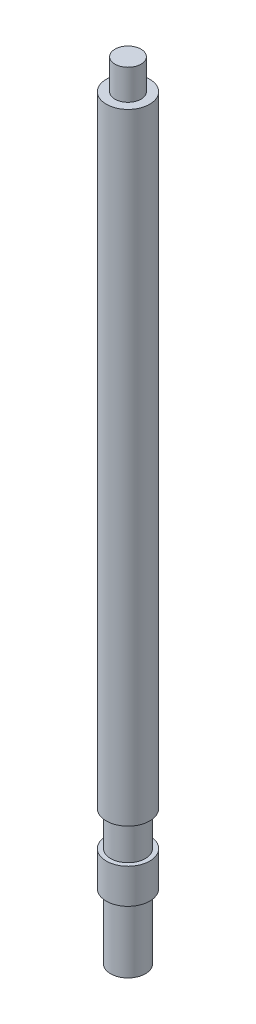
ISO-10303-21;
HEADER;
FILE_DESCRIPTION(('STEP AP214'),'2;1');
FILE_NAME('part.step','',(''),(''),'','','');
FILE_SCHEMA(('AUTOMOTIVE_DESIGN { 1 0 10303 214 1 1 1 1 }'));
ENDSEC;
DATA;
#1=APPLICATION_CONTEXT('core data for automotive mechanical design processes');
#2=APPLICATION_PROTOCOL_DEFINITION('international standard','automotive_design',2000,#1);
#3=PRODUCT_CONTEXT('',#1,'mechanical');
#4=PRODUCT('Part','Part','',(#3));
#5=PRODUCT_RELATED_PRODUCT_CATEGORY('part','',(#4));
#6=PRODUCT_DEFINITION_FORMATION('','',#4);
#7=PRODUCT_DEFINITION_CONTEXT('part definition',#1,'design');
#8=PRODUCT_DEFINITION('design','',#6,#7);
#9=PRODUCT_DEFINITION_SHAPE('','',#8);
#10=(LENGTH_UNIT() NAMED_UNIT(*) SI_UNIT(.MILLI.,.METRE.));
#11=(NAMED_UNIT(*) PLANE_ANGLE_UNIT() SI_UNIT($,.RADIAN.));
#12=(NAMED_UNIT(*) SI_UNIT($,.STERADIAN.) SOLID_ANGLE_UNIT());
#13=UNCERTAINTY_MEASURE_WITH_UNIT(LENGTH_MEASURE(1.E-05),#10,'distance_accuracy_value','');
#14=(GEOMETRIC_REPRESENTATION_CONTEXT(3) GLOBAL_UNCERTAINTY_ASSIGNED_CONTEXT((#13)) GLOBAL_UNIT_ASSIGNED_CONTEXT((#10,
#11,#12)) REPRESENTATION_CONTEXT('',''));
#15=CARTESIAN_POINT('',(0.,0.,0.));
#16=DIRECTION('',(0.,0.,1.));
#17=DIRECTION('',(1.,0.,0.));
#18=AXIS2_PLACEMENT_3D('',#15,#16,#17);
#19=CARTESIAN_POINT('',(0.,143.,0.));
#20=DIRECTION('',(0.,-1.,0.));
#21=DIRECTION('',(0.,0.,-1.));
#22=AXIS2_PLACEMENT_3D('',#19,#20,#21);
#23=CYLINDRICAL_SURFACE('',#22,5.);
#24=CARTESIAN_POINT('',(0.,143.,0.));
#25=DIRECTION('',(0.,1.,0.));
#26=DIRECTION('',(0.,0.,1.));
#27=AXIS2_PLACEMENT_3D('',#24,#25,#26);
#28=CIRCLE('',#27,5.);
#29=CARTESIAN_POINT('',(0.,143.,5.));
#30=VERTEX_POINT('',#29);
#31=EDGE_CURVE('E63',#30,#30,#28,.T.);
#32=ORIENTED_EDGE('',*,*,#31,.F.);
#33=EDGE_LOOP('',(#32));
#34=FACE_BOUND('',#33,.T.);
#35=CARTESIAN_POINT('',(0.,0.,0.));
#36=DIRECTION('',(0.,1.,0.));
#37=DIRECTION('',(0.,0.,1.));
#38=AXIS2_PLACEMENT_3D('',#35,#36,#37);
#39=CIRCLE('',#38,5.);
#40=CARTESIAN_POINT('',(0.,0.,5.));
#41=VERTEX_POINT('',#40);
#42=EDGE_CURVE('E36',#41,#41,#39,.T.);
#43=ORIENTED_EDGE('',*,*,#42,.T.);
#44=EDGE_LOOP('',(#43));
#45=FACE_BOUND('',#44,.T.);
#46=ADVANCED_FACE('F33',(#34,#45),#23,.T.);
#47=CARTESIAN_POINT('',(0.,143.,0.));
#48=DIRECTION('',(0.,1.,0.));
#49=DIRECTION('',(0.,0.,1.));
#50=AXIS2_PLACEMENT_3D('',#47,#48,#49);
#51=PLANE('',#50);
#52=CARTESIAN_POINT('',(0.,143.,0.));
#53=DIRECTION('',(0.,1.,0.));
#54=DIRECTION('',(0.,0.,1.));
#55=AXIS2_PLACEMENT_3D('',#52,#53,#54);
#56=CIRCLE('',#55,3.);
#57=CARTESIAN_POINT('',(0.,143.,3.));
#58=VERTEX_POINT('',#57);
#59=EDGE_CURVE('E10',#58,#58,#56,.T.);
#60=ORIENTED_EDGE('',*,*,#59,.F.);
#61=EDGE_LOOP('',(#60));
#62=FACE_BOUND('',#61,.T.);
#63=ORIENTED_EDGE('',*,*,#31,.T.);
#64=EDGE_LOOP('',(#63));
#65=FACE_BOUND('',#64,.T.);
#66=ADVANCED_FACE('F74',(#62,#65),#51,.T.);
#67=CARTESIAN_POINT('',(0.,0.,0.));
#68=DIRECTION('',(0.,1.,0.));
#69=DIRECTION('',(0.,0.,1.));
#70=AXIS2_PLACEMENT_3D('',#67,#68,#69);
#71=PLANE('',#70);
#72=CARTESIAN_POINT('',(0.,0.,0.));
#73=DIRECTION('',(0.,-1.,0.));
#74=DIRECTION('',(0.,0.,-1.));
#75=AXIS2_PLACEMENT_3D('',#72,#73,#74);
#76=CIRCLE('',#75,4.);
#77=CARTESIAN_POINT('',(0.,0.,-4.));
#78=VERTEX_POINT('',#77);
#79=EDGE_CURVE('E45',#78,#78,#76,.T.);
#80=ORIENTED_EDGE('',*,*,#79,.F.);
#81=EDGE_LOOP('',(#80));
#82=FACE_BOUND('',#81,.T.);
#83=ORIENTED_EDGE('',*,*,#42,.F.);
#84=EDGE_LOOP('',(#83));
#85=FACE_BOUND('',#84,.T.);
#86=ADVANCED_FACE('F71',(#82,#85),#71,.F.);
#87=CARTESIAN_POINT('',(0.,-8.,0.));
#88=DIRECTION('',(0.,1.,0.));
#89=DIRECTION('',(0.,0.,1.));
#90=AXIS2_PLACEMENT_3D('',#87,#88,#89);
#91=CYLINDRICAL_SURFACE('',#90,4.);
#92=CARTESIAN_POINT('',(0.,-8.,0.));
#93=DIRECTION('',(0.,-1.,0.));
#94=DIRECTION('',(0.,0.,-1.));
#95=AXIS2_PLACEMENT_3D('',#92,#93,#94);
#96=CIRCLE('',#95,4.);
#97=CARTESIAN_POINT('',(0.,-8.,-4.));
#98=VERTEX_POINT('',#97);
#99=EDGE_CURVE('E57',#98,#98,#96,.T.);
#100=ORIENTED_EDGE('',*,*,#99,.F.);
#101=EDGE_LOOP('',(#100));
#102=FACE_BOUND('',#101,.T.);
#103=ORIENTED_EDGE('',*,*,#79,.T.);
#104=EDGE_LOOP('',(#103));
#105=FACE_BOUND('',#104,.T.);
#106=ADVANCED_FACE('F73',(#102,#105),#91,.T.);
#107=CARTESIAN_POINT('',(0.,-16.,0.));
#108=DIRECTION('',(0.,1.,0.));
#109=DIRECTION('',(0.,0.,1.));
#110=AXIS2_PLACEMENT_3D('',#107,#108,#109);
#111=CYLINDRICAL_SURFACE('',#110,5.);
#112=CARTESIAN_POINT('',(0.,-16.,0.));
#113=DIRECTION('',(0.,-1.,0.));
#114=DIRECTION('',(0.,0.,-1.));
#115=AXIS2_PLACEMENT_3D('',#112,#113,#114);
#116=CIRCLE('',#115,5.);
#117=CARTESIAN_POINT('',(0.,-16.,-5.));
#118=VERTEX_POINT('',#117);
#119=EDGE_CURVE('E54',#118,#118,#116,.T.);
#120=ORIENTED_EDGE('',*,*,#119,.F.);
#121=EDGE_LOOP('',(#120));
#122=FACE_BOUND('',#121,.T.);
#123=CARTESIAN_POINT('',(0.,-8.,0.));
#124=DIRECTION('',(0.,-1.,0.));
#125=DIRECTION('',(0.,0.,-1.));
#126=AXIS2_PLACEMENT_3D('',#123,#124,#125);
#127=CIRCLE('',#126,5.);
#128=CARTESIAN_POINT('',(0.,-8.,-5.));
#129=VERTEX_POINT('',#128);
#130=EDGE_CURVE('E52',#129,#129,#127,.T.);
#131=ORIENTED_EDGE('',*,*,#130,.T.);
#132=EDGE_LOOP('',(#131));
#133=FACE_BOUND('',#132,.T.);
#134=ADVANCED_FACE('F80',(#122,#133),#111,.T.);
#135=CARTESIAN_POINT('',(0.,-16.,0.));
#136=DIRECTION('',(0.,-1.,0.));
#137=DIRECTION('',(0.,0.,-1.));
#138=AXIS2_PLACEMENT_3D('',#135,#136,#137);
#139=PLANE('',#138);
#140=CARTESIAN_POINT('',(0.,-16.,0.));
#141=DIRECTION('',(0.,-1.,0.));
#142=DIRECTION('',(0.,0.,-1.));
#143=AXIS2_PLACEMENT_3D('',#140,#141,#142);
#144=CIRCLE('',#143,4.);
#145=CARTESIAN_POINT('',(0.,-16.,-4.));
#146=VERTEX_POINT('',#145);
#147=EDGE_CURVE('E40',#146,#146,#144,.T.);
#148=ORIENTED_EDGE('',*,*,#147,.F.);
#149=EDGE_LOOP('',(#148));
#150=FACE_BOUND('',#149,.T.);
#151=ORIENTED_EDGE('',*,*,#119,.T.);
#152=EDGE_LOOP('',(#151));
#153=FACE_BOUND('',#152,.T.);
#154=ADVANCED_FACE('F134',(#150,#153),#139,.T.);
#155=CARTESIAN_POINT('',(0.,-8.,0.));
#156=DIRECTION('',(0.,-1.,0.));
#157=DIRECTION('',(0.,0.,-1.));
#158=AXIS2_PLACEMENT_3D('',#155,#156,#157);
#159=PLANE('',#158);
#160=ORIENTED_EDGE('',*,*,#99,.T.);
#161=EDGE_LOOP('',(#160));
#162=FACE_BOUND('',#161,.T.);
#163=ORIENTED_EDGE('',*,*,#130,.F.);
#164=EDGE_LOOP('',(#163));
#165=FACE_BOUND('',#164,.T.);
#166=ADVANCED_FACE('F132',(#162,#165),#159,.F.);
#167=CARTESIAN_POINT('',(0.,-31.,0.));
#168=DIRECTION('',(0.,1.,0.));
#169=DIRECTION('',(0.,0.,1.));
#170=AXIS2_PLACEMENT_3D('',#167,#168,#169);
#171=CYLINDRICAL_SURFACE('',#170,4.);
#172=CARTESIAN_POINT('',(0.,-31.,0.));
#173=DIRECTION('',(0.,-1.,0.));
#174=DIRECTION('',(0.,0.,-1.));
#175=AXIS2_PLACEMENT_3D('',#172,#173,#174);
#176=CIRCLE('',#175,4.);
#177=CARTESIAN_POINT('',(0.,-31.,-4.));
#178=VERTEX_POINT('',#177);
#179=EDGE_CURVE('E50',#178,#178,#176,.T.);
#180=ORIENTED_EDGE('',*,*,#179,.F.);
#181=EDGE_LOOP('',(#180));
#182=FACE_BOUND('',#181,.T.);
#183=ORIENTED_EDGE('',*,*,#147,.T.);
#184=EDGE_LOOP('',(#183));
#185=FACE_BOUND('',#184,.T.);
#186=ADVANCED_FACE('F128',(#182,#185),#171,.T.);
#187=CARTESIAN_POINT('',(0.,-31.,0.));
#188=DIRECTION('',(0.,-1.,0.));
#189=DIRECTION('',(0.,0.,-1.));
#190=AXIS2_PLACEMENT_3D('',#187,#188,#189);
#191=PLANE('',#190);
#192=ORIENTED_EDGE('',*,*,#179,.T.);
#193=EDGE_LOOP('',(#192));
#194=FACE_BOUND('',#193,.T.);
#195=ADVANCED_FACE('F101',(#194),#191,.T.);
#196=CARTESIAN_POINT('',(0.,150.,0.));
#197=DIRECTION('',(0.,-1.,0.));
#198=DIRECTION('',(0.,0.,-1.));
#199=AXIS2_PLACEMENT_3D('',#196,#197,#198);
#200=CYLINDRICAL_SURFACE('',#199,3.);
#201=CARTESIAN_POINT('',(0.,150.,0.));
#202=DIRECTION('',(0.,1.,0.));
#203=DIRECTION('',(0.,0.,1.));
#204=AXIS2_PLACEMENT_3D('',#201,#202,#203);
#205=CIRCLE('',#204,3.);
#206=CARTESIAN_POINT('',(0.,150.,3.));
#207=VERTEX_POINT('',#206);
#208=EDGE_CURVE('E49',#207,#207,#205,.T.);
#209=ORIENTED_EDGE('',*,*,#208,.F.);
#210=EDGE_LOOP('',(#209));
#211=FACE_BOUND('',#210,.T.);
#212=ORIENTED_EDGE('',*,*,#59,.T.);
#213=EDGE_LOOP('',(#212));
#214=FACE_BOUND('',#213,.T.);
#215=ADVANCED_FACE('F106',(#211,#214),#200,.T.);
#216=CARTESIAN_POINT('',(0.,150.,0.));
#217=DIRECTION('',(0.,1.,0.));
#218=DIRECTION('',(0.,0.,1.));
#219=AXIS2_PLACEMENT_3D('',#216,#217,#218);
#220=PLANE('',#219);
#221=ORIENTED_EDGE('',*,*,#208,.T.);
#222=EDGE_LOOP('',(#221));
#223=FACE_BOUND('',#222,.T.);
#224=ADVANCED_FACE('F111',(#223),#220,.T.);
#225=CLOSED_SHELL('',(#46,#66,#86,#106,#134,#154,#166,#186,#195,#215,#224));
#226=MANIFOLD_SOLID_BREP('B2',#225);
#227=ADVANCED_BREP_SHAPE_REPRESENTATION('',(#18,#226),#14);
#228=SHAPE_DEFINITION_REPRESENTATION(#9,#227);
ENDSEC;
END-ISO-10303-21;
